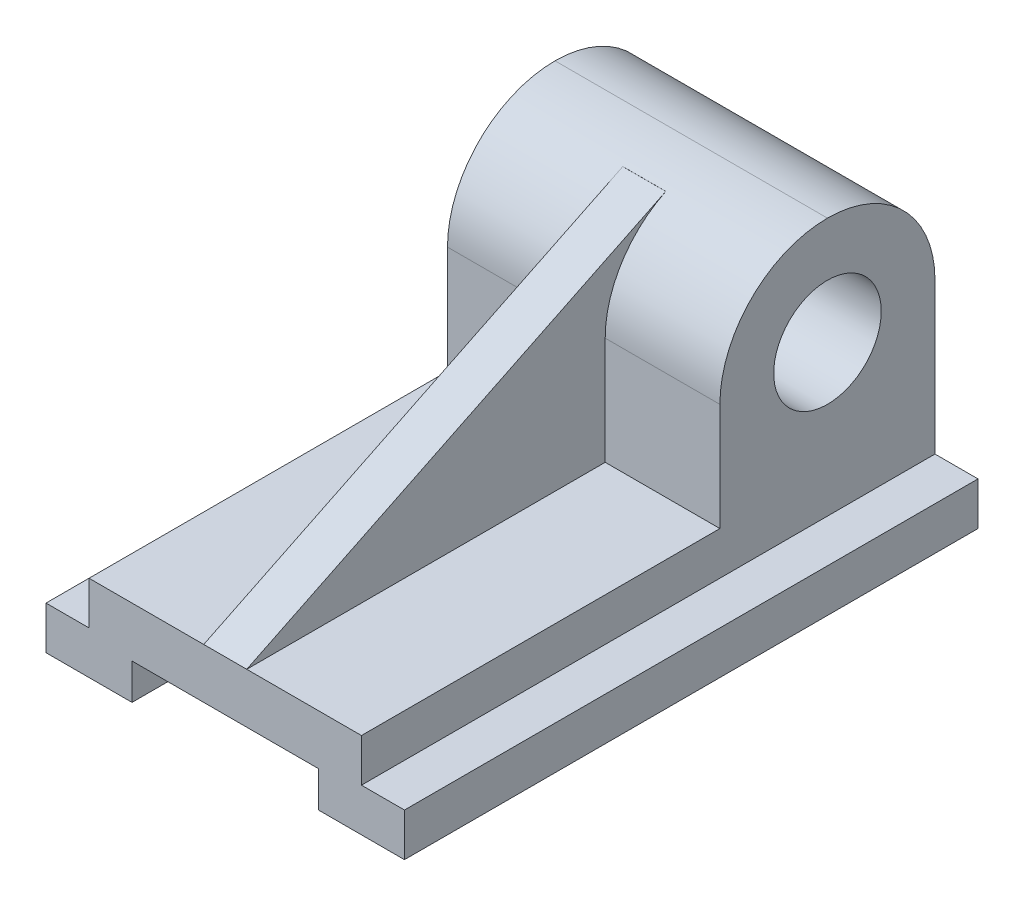
ISO-10303-21;
HEADER;
FILE_DESCRIPTION(('STEP AP214'),'2;1');
FILE_NAME('part.step','',(''),(''),'','','');
FILE_SCHEMA(('AUTOMOTIVE_DESIGN { 1 0 10303 214 1 1 1 1 }'));
ENDSEC;
DATA;
#1=APPLICATION_CONTEXT('core data for automotive mechanical design processes');
#2=APPLICATION_PROTOCOL_DEFINITION('international standard','automotive_design',2000,#1);
#3=PRODUCT_CONTEXT('',#1,'mechanical');
#4=PRODUCT('Part','Part','',(#3));
#5=PRODUCT_RELATED_PRODUCT_CATEGORY('part','',(#4));
#6=PRODUCT_DEFINITION_FORMATION('','',#4);
#7=PRODUCT_DEFINITION_CONTEXT('part definition',#1,'design');
#8=PRODUCT_DEFINITION('design','',#6,#7);
#9=PRODUCT_DEFINITION_SHAPE('','',#8);
#10=(LENGTH_UNIT() NAMED_UNIT(*) SI_UNIT(.MILLI.,.METRE.));
#11=(NAMED_UNIT(*) PLANE_ANGLE_UNIT() SI_UNIT($,.RADIAN.));
#12=(NAMED_UNIT(*) SI_UNIT($,.STERADIAN.) SOLID_ANGLE_UNIT());
#13=UNCERTAINTY_MEASURE_WITH_UNIT(LENGTH_MEASURE(1.E-05),#10,'distance_accuracy_value','');
#14=(GEOMETRIC_REPRESENTATION_CONTEXT(3) GLOBAL_UNCERTAINTY_ASSIGNED_CONTEXT((#13)) GLOBAL_UNIT_ASSIGNED_CONTEXT((#10,
#11,#12)) REPRESENTATION_CONTEXT('',''));
#15=CARTESIAN_POINT('',(0.,0.,0.));
#16=DIRECTION('',(0.,0.,1.));
#17=DIRECTION('',(1.,0.,0.));
#18=AXIS2_PLACEMENT_3D('',#15,#16,#17);
#19=CARTESIAN_POINT('',(-96.52,187.96,152.4));
#20=DIRECTION('',(0.,0.,-1.));
#21=DIRECTION('',(-1.,0.,0.));
#22=AXIS2_PLACEMENT_3D('',#19,#20,#21);
#23=PLANE('',#22);
#24=DIRECTION('',(0.,-1.,0.));
#25=VECTOR('',#24,1.);
#26=CARTESIAN_POINT('',(96.52,187.96,152.4));
#27=LINE('',#26,#25);
#28=CARTESIAN_POINT('',(96.52,111.76,152.4));
#29=VERTEX_POINT('',#28);
#30=CARTESIAN_POINT('',(96.52,35.56,152.4));
#31=VERTEX_POINT('',#30);
#32=EDGE_CURVE('E179',#29,#31,#27,.T.);
#33=ORIENTED_EDGE('',*,*,#32,.F.);
#34=DIRECTION('',(1.,0.,0.));
#35=VECTOR('',#34,1.);
#36=CARTESIAN_POINT('',(-96.52,111.76,152.4));
#37=LINE('',#36,#35);
#38=CARTESIAN_POINT('',(15.24,111.76,152.4));
#39=VERTEX_POINT('',#38);
#40=EDGE_CURVE('E248',#29,#39,#37,.F.);
#41=ORIENTED_EDGE('',*,*,#40,.T.);
#42=DIRECTION('',(0.,-1.,0.));
#43=VECTOR('',#42,1.);
#44=CARTESIAN_POINT('',(15.24,180.34,152.4));
#45=LINE('',#44,#43);
#46=CARTESIAN_POINT('',(15.24,35.56,152.4));
#47=VERTEX_POINT('',#46);
#48=EDGE_CURVE('E197',#39,#47,#45,.T.);
#49=ORIENTED_EDGE('',*,*,#48,.T.);
#50=DIRECTION('',(1.,0.,0.));
#51=VECTOR('',#50,1.);
#52=CARTESIAN_POINT('',(-96.52,35.56,152.4));
#53=LINE('',#52,#51);
#54=EDGE_CURVE('E192',#47,#31,#53,.T.);
#55=ORIENTED_EDGE('',*,*,#54,.T.);
#56=EDGE_LOOP('',(#33,#41,#49,#55));
#57=FACE_BOUND('',#56,.T.);
#58=ADVANCED_FACE('F41',(#57),#23,.F.);
#59=CARTESIAN_POINT('',(96.52,35.56,406.4));
#60=DIRECTION('',(0.,-1.,0.));
#61=DIRECTION('',(1.,0.,0.));
#62=AXIS2_PLACEMENT_3D('',#59,#60,#61);
#63=PLANE('',#62);
#64=DIRECTION('',(0.,0.,-1.));
#65=VECTOR('',#64,1.);
#66=CARTESIAN_POINT('',(15.24,35.56,406.4));
#67=LINE('',#66,#65);
#68=CARTESIAN_POINT('',(15.24,35.56,406.4));
#69=VERTEX_POINT('',#68);
#70=EDGE_CURVE('E290',#69,#47,#67,.T.);
#71=ORIENTED_EDGE('',*,*,#70,.F.);
#72=DIRECTION('',(-1.,0.,0.));
#73=VECTOR('',#72,1.);
#74=CARTESIAN_POINT('',(96.52,35.56,406.4));
#75=LINE('',#74,#73);
#76=CARTESIAN_POINT('',(96.52,35.56,406.4));
#77=VERTEX_POINT('',#76);
#78=EDGE_CURVE('E204',#77,#69,#75,.T.);
#79=ORIENTED_EDGE('',*,*,#78,.F.);
#80=DIRECTION('',(0.,0.,-1.));
#81=VECTOR('',#80,1.);
#82=CARTESIAN_POINT('',(96.52,35.56,406.4));
#83=LINE('',#82,#81);
#84=EDGE_CURVE('E184',#77,#31,#83,.T.);
#85=ORIENTED_EDGE('',*,*,#84,.T.);
#86=ORIENTED_EDGE('',*,*,#54,.F.);
#87=EDGE_LOOP('',(#71,#79,#85,#86));
#88=FACE_BOUND('',#87,.T.);
#89=ADVANCED_FACE('F205',(#88),#63,.F.);
#90=DIRECTION('',(0.,0.,1.));
#91=VECTOR('',#90,1.);
#92=CARTESIAN_POINT('',(-15.24,35.56,406.4));
#93=LINE('',#92,#91);
#94=CARTESIAN_POINT('',(-15.24,35.56,152.4));
#95=VERTEX_POINT('',#94);
#96=CARTESIAN_POINT('',(-15.24,35.56,406.4));
#97=VERTEX_POINT('',#96);
#98=EDGE_CURVE('E279',#95,#97,#93,.T.);
#99=ORIENTED_EDGE('',*,*,#98,.F.);
#100=CARTESIAN_POINT('',(-96.52,35.56,152.4));
#101=VERTEX_POINT('',#100);
#102=EDGE_CURVE('E195',#101,#95,#53,.T.);
#103=ORIENTED_EDGE('',*,*,#102,.F.);
#104=DIRECTION('',(0.,0.,-1.));
#105=VECTOR('',#104,1.);
#106=CARTESIAN_POINT('',(-96.52,35.56,406.4));
#107=LINE('',#106,#105);
#108=CARTESIAN_POINT('',(-96.52,35.56,406.4));
#109=VERTEX_POINT('',#108);
#110=EDGE_CURVE('E206',#109,#101,#107,.T.);
#111=ORIENTED_EDGE('',*,*,#110,.F.);
#112=EDGE_CURVE('E275',#97,#109,#75,.T.);
#113=ORIENTED_EDGE('',*,*,#112,.F.);
#114=EDGE_LOOP('',(#99,#103,#111,#113));
#115=FACE_BOUND('',#114,.T.);
#116=ADVANCED_FACE('F277',(#115),#63,.F.);
#117=DIRECTION('',(0.,-1.,0.));
#118=VECTOR('',#117,1.);
#119=CARTESIAN_POINT('',(-15.24,180.34,152.4));
#120=LINE('',#119,#118);
#121=CARTESIAN_POINT('',(-15.24,111.76,152.4));
#122=VERTEX_POINT('',#121);
#123=EDGE_CURVE('E283',#122,#95,#120,.T.);
#124=ORIENTED_EDGE('',*,*,#123,.F.);
#125=DIRECTION('',(1.,0.,0.));
#126=VECTOR('',#125,1.);
#127=CARTESIAN_POINT('',(-96.52,111.76,152.4));
#128=LINE('',#127,#126);
#129=CARTESIAN_POINT('',(-96.52,111.76,152.4));
#130=VERTEX_POINT('',#129);
#131=EDGE_CURVE('E241',#122,#130,#128,.F.);
#132=ORIENTED_EDGE('',*,*,#131,.T.);
#133=DIRECTION('',(0.,-1.,0.));
#134=VECTOR('',#133,1.);
#135=CARTESIAN_POINT('',(-96.52,187.96,152.4));
#136=LINE('',#135,#134);
#137=EDGE_CURVE('E193',#130,#101,#136,.T.);
#138=ORIENTED_EDGE('',*,*,#137,.T.);
#139=ORIENTED_EDGE('',*,*,#102,.T.);
#140=EDGE_LOOP('',(#124,#132,#138,#139));
#141=FACE_BOUND('',#140,.T.);
#142=ADVANCED_FACE('F365',(#141),#23,.F.);
#143=CARTESIAN_POINT('',(-96.52,35.56,406.4));
#144=DIRECTION('',(1.,0.,0.));
#145=DIRECTION('',(0.,0.,-1.));
#146=AXIS2_PLACEMENT_3D('',#143,#144,#145);
#147=PLANE('',#146);
#148=CARTESIAN_POINT('',(-96.52,111.76,76.2));
#149=DIRECTION('',(1.,0.,0.));
#150=DIRECTION('',(0.,0.,-1.));
#151=AXIS2_PLACEMENT_3D('',#148,#149,#150);
#152=CIRCLE('',#151,38.1);
#153=CARTESIAN_POINT('',(-96.52,111.76,38.1));
#154=VERTEX_POINT('',#153);
#155=EDGE_CURVE('E303',#154,#154,#152,.T.);
#156=ORIENTED_EDGE('',*,*,#155,.T.);
#157=EDGE_LOOP('',(#156));
#158=FACE_BOUND('',#157,.T.);
#159=ORIENTED_EDGE('',*,*,#137,.F.);
#160=CARTESIAN_POINT('',(-96.52,111.76,76.2));
#161=DIRECTION('',(1.,0.,0.));
#162=DIRECTION('',(0.,0.,-1.));
#163=AXIS2_PLACEMENT_3D('',#160,#161,#162);
#164=CIRCLE('',#163,76.2);
#165=CARTESIAN_POINT('',(-96.52,187.96,76.2));
#166=VERTEX_POINT('',#165);
#167=EDGE_CURVE('E247',#130,#166,#164,.F.);
#168=ORIENTED_EDGE('',*,*,#167,.T.);
#169=CARTESIAN_POINT('',(-96.52,111.76,76.2));
#170=DIRECTION('',(1.,0.,0.));
#171=DIRECTION('',(0.,0.,-1.));
#172=AXIS2_PLACEMENT_3D('',#169,#170,#171);
#173=CIRCLE('',#172,76.2);
#174=CARTESIAN_POINT('',(-96.52,111.76,0.));
#175=VERTEX_POINT('',#174);
#176=EDGE_CURVE('E246',#166,#175,#173,.F.);
#177=ORIENTED_EDGE('',*,*,#176,.T.);
#178=DIRECTION('',(0.,-1.,0.));
#179=VECTOR('',#178,1.);
#180=CARTESIAN_POINT('',(-96.52,35.56,0.));
#181=LINE('',#180,#179);
#182=CARTESIAN_POINT('',(-96.52,5.08,0.));
#183=VERTEX_POINT('',#182);
#184=EDGE_CURVE('E308',#175,#183,#181,.T.);
#185=ORIENTED_EDGE('',*,*,#184,.T.);
#186=DIRECTION('',(0.,0.,-1.));
#187=VECTOR('',#186,1.);
#188=CARTESIAN_POINT('',(-96.52,5.08,406.4));
#189=LINE('',#188,#187);
#190=CARTESIAN_POINT('',(-96.52,5.08,406.4));
#191=VERTEX_POINT('',#190);
#192=EDGE_CURVE('E236',#191,#183,#189,.T.);
#193=ORIENTED_EDGE('',*,*,#192,.F.);
#194=DIRECTION('',(0.,-1.,0.));
#195=VECTOR('',#194,1.);
#196=CARTESIAN_POINT('',(-96.52,35.56,406.4));
#197=LINE('',#196,#195);
#198=EDGE_CURVE('E307',#109,#191,#197,.T.);
#199=ORIENTED_EDGE('',*,*,#198,.F.);
#200=ORIENTED_EDGE('',*,*,#110,.T.);
#201=EDGE_LOOP('',(#159,#168,#177,#185,#193,#199,#200));
#202=FACE_BOUND('',#201,.T.);
#203=ADVANCED_FACE('F370',(#158,#202),#147,.F.);
#204=CARTESIAN_POINT('',(-96.52,5.08,406.4));
#205=DIRECTION('',(0.,-1.,0.));
#206=DIRECTION('',(1.,0.,0.));
#207=AXIS2_PLACEMENT_3D('',#204,#205,#206);
#208=PLANE('',#207);
#209=DIRECTION('',(-1.,0.,0.));
#210=VECTOR('',#209,1.);
#211=CARTESIAN_POINT('',(-96.52,5.08,0.));
#212=LINE('',#211,#210);
#213=CARTESIAN_POINT('',(-127.,5.07999999999999,0.));
#214=VERTEX_POINT('',#213);
#215=EDGE_CURVE('E329',#183,#214,#212,.T.);
#216=ORIENTED_EDGE('',*,*,#215,.T.);
#217=DIRECTION('',(0.,0.,-1.));
#218=VECTOR('',#217,1.);
#219=CARTESIAN_POINT('',(-127.,5.07999999999999,406.4));
#220=LINE('',#219,#218);
#221=CARTESIAN_POINT('',(-127.,5.07999999999999,406.4));
#222=VERTEX_POINT('',#221);
#223=EDGE_CURVE('E232',#222,#214,#220,.T.);
#224=ORIENTED_EDGE('',*,*,#223,.F.);
#225=DIRECTION('',(-1.,0.,0.));
#226=VECTOR('',#225,1.);
#227=CARTESIAN_POINT('',(-96.52,5.08,406.4));
#228=LINE('',#227,#226);
#229=EDGE_CURVE('E310',#191,#222,#228,.T.);
#230=ORIENTED_EDGE('',*,*,#229,.F.);
#231=ORIENTED_EDGE('',*,*,#192,.T.);
#232=EDGE_LOOP('',(#216,#224,#230,#231));
#233=FACE_BOUND('',#232,.T.);
#234=ADVANCED_FACE('F373',(#233),#208,.F.);
#235=CARTESIAN_POINT('',(-127.,5.07999999999999,406.4));
#236=DIRECTION('',(1.,0.,0.));
#237=DIRECTION('',(0.,0.,-1.));
#238=AXIS2_PLACEMENT_3D('',#235,#236,#237);
#239=PLANE('',#238);
#240=DIRECTION('',(0.,-1.,0.));
#241=VECTOR('',#240,1.);
#242=CARTESIAN_POINT('',(-127.,5.07999999999999,0.));
#243=LINE('',#242,#241);
#244=CARTESIAN_POINT('',(-127.,-25.4,0.));
#245=VERTEX_POINT('',#244);
#246=EDGE_CURVE('E335',#214,#245,#243,.T.);
#247=ORIENTED_EDGE('',*,*,#246,.T.);
#248=DIRECTION('',(0.,0.,-1.));
#249=VECTOR('',#248,1.);
#250=CARTESIAN_POINT('',(-127.,-25.4,406.4));
#251=LINE('',#250,#249);
#252=CARTESIAN_POINT('',(-127.,-25.4,406.4));
#253=VERTEX_POINT('',#252);
#254=EDGE_CURVE('E235',#253,#245,#251,.T.);
#255=ORIENTED_EDGE('',*,*,#254,.F.);
#256=DIRECTION('',(0.,-1.,0.));
#257=VECTOR('',#256,1.);
#258=CARTESIAN_POINT('',(-127.,5.07999999999999,406.4));
#259=LINE('',#258,#257);
#260=EDGE_CURVE('E315',#222,#253,#259,.T.);
#261=ORIENTED_EDGE('',*,*,#260,.F.);
#262=ORIENTED_EDGE('',*,*,#223,.T.);
#263=EDGE_LOOP('',(#247,#255,#261,#262));
#264=FACE_BOUND('',#263,.T.);
#265=ADVANCED_FACE('F380',(#264),#239,.F.);
#266=CARTESIAN_POINT('',(-127.,-25.4,406.4));
#267=DIRECTION('',(0.,1.,0.));
#268=DIRECTION('',(0.,0.,1.));
#269=AXIS2_PLACEMENT_3D('',#266,#267,#268);
#270=PLANE('',#269);
#271=DIRECTION('',(1.,0.,0.));
#272=VECTOR('',#271,1.);
#273=CARTESIAN_POINT('',(-127.,-25.4,0.));
#274=LINE('',#273,#272);
#275=CARTESIAN_POINT('',(-66.04,-25.4,0.));
#276=VERTEX_POINT('',#275);
#277=EDGE_CURVE('E331',#245,#276,#274,.T.);
#278=ORIENTED_EDGE('',*,*,#277,.T.);
#279=DIRECTION('',(0.,0.,-1.));
#280=VECTOR('',#279,1.);
#281=CARTESIAN_POINT('',(-66.04,-25.4,406.4));
#282=LINE('',#281,#280);
#283=CARTESIAN_POINT('',(-66.04,-25.4,406.4));
#284=VERTEX_POINT('',#283);
#285=EDGE_CURVE('E226',#284,#276,#282,.T.);
#286=ORIENTED_EDGE('',*,*,#285,.F.);
#287=DIRECTION('',(1.,0.,0.));
#288=VECTOR('',#287,1.);
#289=CARTESIAN_POINT('',(-127.,-25.4,406.4));
#290=LINE('',#289,#288);
#291=EDGE_CURVE('E314',#253,#284,#290,.T.);
#292=ORIENTED_EDGE('',*,*,#291,.F.);
#293=ORIENTED_EDGE('',*,*,#254,.T.);
#294=EDGE_LOOP('',(#278,#286,#292,#293));
#295=FACE_BOUND('',#294,.T.);
#296=ADVANCED_FACE('F385',(#295),#270,.F.);
#297=CARTESIAN_POINT('',(-66.04,-25.4,406.4));
#298=DIRECTION('',(-1.,0.,0.));
#299=DIRECTION('',(0.,0.,1.));
#300=AXIS2_PLACEMENT_3D('',#297,#298,#299);
#301=PLANE('',#300);
#302=DIRECTION('',(0.,1.,0.));
#303=VECTOR('',#302,1.);
#304=CARTESIAN_POINT('',(-66.04,-25.4,0.));
#305=LINE('',#304,#303);
#306=CARTESIAN_POINT('',(-66.04,0.,0.));
#307=VERTEX_POINT('',#306);
#308=EDGE_CURVE('E337',#276,#307,#305,.T.);
#309=ORIENTED_EDGE('',*,*,#308,.T.);
#310=DIRECTION('',(0.,0.,-1.));
#311=VECTOR('',#310,1.);
#312=CARTESIAN_POINT('',(-66.04,0.,406.4));
#313=LINE('',#312,#311);
#314=CARTESIAN_POINT('',(-66.04,0.,406.4));
#315=VERTEX_POINT('',#314);
#316=EDGE_CURVE('E227',#315,#307,#313,.T.);
#317=ORIENTED_EDGE('',*,*,#316,.F.);
#318=DIRECTION('',(0.,1.,0.));
#319=VECTOR('',#318,1.);
#320=CARTESIAN_POINT('',(-66.04,-25.4,406.4));
#321=LINE('',#320,#319);
#322=EDGE_CURVE('E316',#284,#315,#321,.T.);
#323=ORIENTED_EDGE('',*,*,#322,.F.);
#324=ORIENTED_EDGE('',*,*,#285,.T.);
#325=EDGE_LOOP('',(#309,#317,#323,#324));
#326=FACE_BOUND('',#325,.T.);
#327=ADVANCED_FACE('F389',(#326),#301,.F.);
#328=CARTESIAN_POINT('',(-66.04,0.,406.4));
#329=DIRECTION('',(0.,1.,0.));
#330=DIRECTION('',(-1.,0.,0.));
#331=AXIS2_PLACEMENT_3D('',#328,#329,#330);
#332=PLANE('',#331);
#333=DIRECTION('',(1.,0.,0.));
#334=VECTOR('',#333,1.);
#335=CARTESIAN_POINT('',(-66.04,0.,0.));
#336=LINE('',#335,#334);
#337=CARTESIAN_POINT('',(66.04,0.,0.));
#338=VERTEX_POINT('',#337);
#339=EDGE_CURVE('E340',#307,#338,#336,.T.);
#340=ORIENTED_EDGE('',*,*,#339,.T.);
#341=DIRECTION('',(0.,0.,-1.));
#342=VECTOR('',#341,1.);
#343=CARTESIAN_POINT('',(66.04,0.,406.4));
#344=LINE('',#343,#342);
#345=CARTESIAN_POINT('',(66.04,0.,406.4));
#346=VERTEX_POINT('',#345);
#347=EDGE_CURVE('E224',#346,#338,#344,.T.);
#348=ORIENTED_EDGE('',*,*,#347,.F.);
#349=DIRECTION('',(1.,0.,0.));
#350=VECTOR('',#349,1.);
#351=CARTESIAN_POINT('',(-66.04,0.,406.4));
#352=LINE('',#351,#350);
#353=EDGE_CURVE('E318',#315,#346,#352,.T.);
#354=ORIENTED_EDGE('',*,*,#353,.F.);
#355=ORIENTED_EDGE('',*,*,#316,.T.);
#356=EDGE_LOOP('',(#340,#348,#354,#355));
#357=FACE_BOUND('',#356,.T.);
#358=ADVANCED_FACE('F394',(#357),#332,.F.);
#359=CARTESIAN_POINT('',(66.04,0.,406.4));
#360=DIRECTION('',(1.,0.,0.));
#361=DIRECTION('',(0.,1.,0.));
#362=AXIS2_PLACEMENT_3D('',#359,#360,#361);
#363=PLANE('',#362);
#364=DIRECTION('',(0.,-1.,0.));
#365=VECTOR('',#364,1.);
#366=CARTESIAN_POINT('',(66.04,0.,0.));
#367=LINE('',#366,#365);
#368=CARTESIAN_POINT('',(66.04,-25.4,0.));
#369=VERTEX_POINT('',#368);
#370=EDGE_CURVE('E338',#338,#369,#367,.T.);
#371=ORIENTED_EDGE('',*,*,#370,.T.);
#372=DIRECTION('',(0.,0.,-1.));
#373=VECTOR('',#372,1.);
#374=CARTESIAN_POINT('',(66.04,-25.4,406.4));
#375=LINE('',#374,#373);
#376=CARTESIAN_POINT('',(66.04,-25.4,406.4));
#377=VERTEX_POINT('',#376);
#378=EDGE_CURVE('E219',#377,#369,#375,.T.);
#379=ORIENTED_EDGE('',*,*,#378,.F.);
#380=DIRECTION('',(0.,-1.,0.));
#381=VECTOR('',#380,1.);
#382=CARTESIAN_POINT('',(66.04,0.,406.4));
#383=LINE('',#382,#381);
#384=EDGE_CURVE('E319',#346,#377,#383,.T.);
#385=ORIENTED_EDGE('',*,*,#384,.F.);
#386=ORIENTED_EDGE('',*,*,#347,.T.);
#387=EDGE_LOOP('',(#371,#379,#385,#386));
#388=FACE_BOUND('',#387,.T.);
#389=ADVANCED_FACE('F400',(#388),#363,.F.);
#390=CARTESIAN_POINT('',(66.04,-25.4,406.4));
#391=DIRECTION('',(0.,1.,0.));
#392=DIRECTION('',(0.,0.,1.));
#393=AXIS2_PLACEMENT_3D('',#390,#391,#392);
#394=PLANE('',#393);
#395=DIRECTION('',(1.,0.,0.));
#396=VECTOR('',#395,1.);
#397=CARTESIAN_POINT('',(66.04,-25.4,0.));
#398=LINE('',#397,#396);
#399=CARTESIAN_POINT('',(127.,-25.4,0.));
#400=VERTEX_POINT('',#399);
#401=EDGE_CURVE('E345',#369,#400,#398,.T.);
#402=ORIENTED_EDGE('',*,*,#401,.T.);
#403=DIRECTION('',(0.,0.,-1.));
#404=VECTOR('',#403,1.);
#405=CARTESIAN_POINT('',(127.,-25.4,406.4));
#406=LINE('',#405,#404);
#407=CARTESIAN_POINT('',(127.,-25.4,406.4));
#408=VERTEX_POINT('',#407);
#409=EDGE_CURVE('E220',#408,#400,#406,.T.);
#410=ORIENTED_EDGE('',*,*,#409,.F.);
#411=DIRECTION('',(1.,0.,0.));
#412=VECTOR('',#411,1.);
#413=CARTESIAN_POINT('',(66.04,-25.4,406.4));
#414=LINE('',#413,#412);
#415=EDGE_CURVE('E325',#377,#408,#414,.T.);
#416=ORIENTED_EDGE('',*,*,#415,.F.);
#417=ORIENTED_EDGE('',*,*,#378,.T.);
#418=EDGE_LOOP('',(#402,#410,#416,#417));
#419=FACE_BOUND('',#418,.T.);
#420=ADVANCED_FACE('F401',(#419),#394,.F.);
#421=CARTESIAN_POINT('',(127.,-25.4,406.4));
#422=DIRECTION('',(-1.,0.,0.));
#423=DIRECTION('',(0.,0.,1.));
#424=AXIS2_PLACEMENT_3D('',#421,#422,#423);
#425=PLANE('',#424);
#426=DIRECTION('',(0.,1.,0.));
#427=VECTOR('',#426,1.);
#428=CARTESIAN_POINT('',(127.,-25.4,0.));
#429=LINE('',#428,#427);
#430=CARTESIAN_POINT('',(127.,5.08000000000001,0.));
#431=VERTEX_POINT('',#430);
#432=EDGE_CURVE('E344',#400,#431,#429,.T.);
#433=ORIENTED_EDGE('',*,*,#432,.T.);
#434=DIRECTION('',(0.,0.,-1.));
#435=VECTOR('',#434,1.);
#436=CARTESIAN_POINT('',(127.,5.08000000000001,406.4));
#437=LINE('',#436,#435);
#438=CARTESIAN_POINT('',(127.,5.08000000000001,406.4));
#439=VERTEX_POINT('',#438);
#440=EDGE_CURVE('E207',#439,#431,#437,.T.);
#441=ORIENTED_EDGE('',*,*,#440,.F.);
#442=DIRECTION('',(0.,1.,0.));
#443=VECTOR('',#442,1.);
#444=CARTESIAN_POINT('',(127.,-25.4,406.4));
#445=LINE('',#444,#443);
#446=EDGE_CURVE('E322',#408,#439,#445,.T.);
#447=ORIENTED_EDGE('',*,*,#446,.F.);
#448=ORIENTED_EDGE('',*,*,#409,.T.);
#449=EDGE_LOOP('',(#433,#441,#447,#448));
#450=FACE_BOUND('',#449,.T.);
#451=ADVANCED_FACE('F409',(#450),#425,.F.);
#452=CARTESIAN_POINT('',(127.,5.08000000000001,406.4));
#453=DIRECTION('',(0.,-1.,0.));
#454=DIRECTION('',(1.,0.,0.));
#455=AXIS2_PLACEMENT_3D('',#452,#453,#454);
#456=PLANE('',#455);
#457=DIRECTION('',(-1.,0.,0.));
#458=VECTOR('',#457,1.);
#459=CARTESIAN_POINT('',(127.,5.08000000000001,0.));
#460=LINE('',#459,#458);
#461=CARTESIAN_POINT('',(96.52,5.07999999999999,0.));
#462=VERTEX_POINT('',#461);
#463=EDGE_CURVE('E347',#431,#462,#460,.T.);
#464=ORIENTED_EDGE('',*,*,#463,.T.);
#465=DIRECTION('',(0.,0.,-1.));
#466=VECTOR('',#465,1.);
#467=CARTESIAN_POINT('',(96.52,5.07999999999999,406.4));
#468=LINE('',#467,#466);
#469=CARTESIAN_POINT('',(96.52,5.07999999999999,406.4));
#470=VERTEX_POINT('',#469);
#471=EDGE_CURVE('E202',#470,#462,#468,.T.);
#472=ORIENTED_EDGE('',*,*,#471,.F.);
#473=DIRECTION('',(-1.,0.,0.));
#474=VECTOR('',#473,1.);
#475=CARTESIAN_POINT('',(127.,5.08000000000001,406.4));
#476=LINE('',#475,#474);
#477=EDGE_CURVE('E326',#439,#470,#476,.T.);
#478=ORIENTED_EDGE('',*,*,#477,.F.);
#479=ORIENTED_EDGE('',*,*,#440,.T.);
#480=EDGE_LOOP('',(#464,#472,#478,#479));
#481=FACE_BOUND('',#480,.T.);
#482=ADVANCED_FACE('F408',(#481),#456,.F.);
#483=CARTESIAN_POINT('',(96.52,5.07999999999999,406.4));
#484=DIRECTION('',(-1.,0.,0.));
#485=DIRECTION('',(0.,0.,1.));
#486=AXIS2_PLACEMENT_3D('',#483,#484,#485);
#487=PLANE('',#486);
#488=CARTESIAN_POINT('',(96.52,111.76,76.2));
#489=DIRECTION('',(1.,0.,0.));
#490=DIRECTION('',(0.,0.,-1.));
#491=AXIS2_PLACEMENT_3D('',#488,#489,#490);
#492=CIRCLE('',#491,38.1);
#493=CARTESIAN_POINT('',(96.52,111.76,38.1));
#494=VERTEX_POINT('',#493);
#495=EDGE_CURVE('E266',#494,#494,#492,.T.);
#496=ORIENTED_EDGE('',*,*,#495,.F.);
#497=EDGE_LOOP('',(#496));
#498=FACE_BOUND('',#497,.T.);
#499=CARTESIAN_POINT('',(96.52,111.76,76.2));
#500=DIRECTION('',(-1.,0.,0.));
#501=DIRECTION('',(0.,0.,1.));
#502=AXIS2_PLACEMENT_3D('',#499,#500,#501);
#503=CIRCLE('',#502,76.2);
#504=CARTESIAN_POINT('',(96.52,111.76,0.));
#505=VERTEX_POINT('',#504);
#506=CARTESIAN_POINT('',(96.52,187.96,76.2));
#507=VERTEX_POINT('',#506);
#508=EDGE_CURVE('E242',#505,#507,#503,.F.);
#509=ORIENTED_EDGE('',*,*,#508,.T.);
#510=CARTESIAN_POINT('',(96.52,111.76,76.2));
#511=DIRECTION('',(-1.,0.,0.));
#512=DIRECTION('',(0.,0.,1.));
#513=AXIS2_PLACEMENT_3D('',#510,#511,#512);
#514=CIRCLE('',#513,76.2);
#515=EDGE_CURVE('E189',#507,#29,#514,.F.);
#516=ORIENTED_EDGE('',*,*,#515,.T.);
#517=ORIENTED_EDGE('',*,*,#32,.T.);
#518=ORIENTED_EDGE('',*,*,#84,.F.);
#519=DIRECTION('',(0.,1.,0.));
#520=VECTOR('',#519,1.);
#521=CARTESIAN_POINT('',(96.52,5.07999999999999,406.4));
#522=LINE('',#521,#520);
#523=EDGE_CURVE('E282',#470,#77,#522,.T.);
#524=ORIENTED_EDGE('',*,*,#523,.F.);
#525=ORIENTED_EDGE('',*,*,#471,.T.);
#526=DIRECTION('',(0.,1.,0.));
#527=VECTOR('',#526,1.);
#528=CARTESIAN_POINT('',(96.52,5.07999999999999,0.));
#529=LINE('',#528,#527);
#530=EDGE_CURVE('E309',#462,#505,#529,.T.);
#531=ORIENTED_EDGE('',*,*,#530,.T.);
#532=EDGE_LOOP('',(#509,#516,#517,#518,#524,#525,#531));
#533=FACE_BOUND('',#532,.T.);
#534=ADVANCED_FACE('F182',(#498,#533),#487,.F.);
#535=CARTESIAN_POINT('',(0.,0.,406.4));
#536=DIRECTION('',(0.,0.,-1.));
#537=DIRECTION('',(-1.,0.,0.));
#538=AXIS2_PLACEMENT_3D('',#535,#536,#537);
#539=PLANE('',#538);
#540=ORIENTED_EDGE('',*,*,#78,.T.);
#541=DIRECTION('',(-1.,0.,0.));
#542=VECTOR('',#541,1.);
#543=CARTESIAN_POINT('',(0.,35.5599999999998,406.4));
#544=LINE('',#543,#542);
#545=EDGE_CURVE('E49',#69,#97,#544,.T.);
#546=ORIENTED_EDGE('',*,*,#545,.T.);
#547=ORIENTED_EDGE('',*,*,#112,.T.);
#548=ORIENTED_EDGE('',*,*,#198,.T.);
#549=ORIENTED_EDGE('',*,*,#229,.T.);
#550=ORIENTED_EDGE('',*,*,#260,.T.);
#551=ORIENTED_EDGE('',*,*,#291,.T.);
#552=ORIENTED_EDGE('',*,*,#322,.T.);
#553=ORIENTED_EDGE('',*,*,#353,.T.);
#554=ORIENTED_EDGE('',*,*,#384,.T.);
#555=ORIENTED_EDGE('',*,*,#415,.T.);
#556=ORIENTED_EDGE('',*,*,#446,.T.);
#557=ORIENTED_EDGE('',*,*,#477,.T.);
#558=ORIENTED_EDGE('',*,*,#523,.T.);
#559=EDGE_LOOP('',(#540,#546,#547,#548,#549,#550,#551,#552,#553,#554,#555,#556,#557,#558));
#560=FACE_BOUND('',#559,.T.);
#561=ADVANCED_FACE('F269',(#560),#539,.F.);
#562=CARTESIAN_POINT('',(0.,0.,0.));
#563=DIRECTION('',(0.,0.,-1.));
#564=DIRECTION('',(-1.,0.,0.));
#565=AXIS2_PLACEMENT_3D('',#562,#563,#564);
#566=PLANE('',#565);
#567=ORIENTED_EDGE('',*,*,#184,.F.);
#568=DIRECTION('',(-1.,0.,0.));
#569=VECTOR('',#568,1.);
#570=CARTESIAN_POINT('',(0.,111.76,0.));
#571=LINE('',#570,#569);
#572=EDGE_CURVE('E252',#175,#505,#571,.F.);
#573=ORIENTED_EDGE('',*,*,#572,.T.);
#574=ORIENTED_EDGE('',*,*,#530,.F.);
#575=ORIENTED_EDGE('',*,*,#463,.F.);
#576=ORIENTED_EDGE('',*,*,#432,.F.);
#577=ORIENTED_EDGE('',*,*,#401,.F.);
#578=ORIENTED_EDGE('',*,*,#370,.F.);
#579=ORIENTED_EDGE('',*,*,#339,.F.);
#580=ORIENTED_EDGE('',*,*,#308,.F.);
#581=ORIENTED_EDGE('',*,*,#277,.F.);
#582=ORIENTED_EDGE('',*,*,#246,.F.);
#583=ORIENTED_EDGE('',*,*,#215,.F.);
#584=EDGE_LOOP('',(#567,#573,#574,#575,#576,#577,#578,#579,#580,#581,#582,#583));
#585=FACE_BOUND('',#584,.T.);
#586=ADVANCED_FACE('F415',(#585),#566,.T.);
#587=CARTESIAN_POINT('',(15.24,180.34,406.4));
#588=DIRECTION('',(-1.,0.,0.));
#589=DIRECTION('',(0.,-1.,0.));
#590=AXIS2_PLACEMENT_3D('',#587,#588,#589);
#591=PLANE('',#590);
#592=DIRECTION('',(0.,0.,-1.));
#593=VECTOR('',#592,1.);
#594=CARTESIAN_POINT('',(15.24,180.34,406.4));
#595=LINE('',#594,#593);
#596=CARTESIAN_POINT('',(15.24,180.34,109.473999999998));
#597=VERTEX_POINT('',#596);
#598=CARTESIAN_POINT('',(15.24,180.34,109.41480994978));
#599=VERTEX_POINT('',#598);
#600=EDGE_CURVE('E288',#597,#599,#595,.T.);
#601=ORIENTED_EDGE('',*,*,#600,.F.);
#602=DIRECTION('',(0.,0.43827213690412,-0.898842329896349));
#603=VECTOR('',#602,1.);
#604=CARTESIAN_POINT('',(15.24,180.34,109.473999999998));
#605=LINE('',#604,#603);
#606=EDGE_CURVE('E65',#597,#69,#605,.F.);
#607=ORIENTED_EDGE('',*,*,#606,.T.);
#608=ORIENTED_EDGE('',*,*,#70,.T.);
#609=ORIENTED_EDGE('',*,*,#48,.F.);
#610=CARTESIAN_POINT('',(15.24,111.76,76.2));
#611=DIRECTION('',(-1.,0.,0.));
#612=DIRECTION('',(0.,-1.,0.));
#613=AXIS2_PLACEMENT_3D('',#610,#611,#612);
#614=CIRCLE('',#613,76.2);
#615=EDGE_CURVE('E255',#39,#599,#614,.T.);
#616=ORIENTED_EDGE('',*,*,#615,.T.);
#617=EDGE_LOOP('',(#601,#607,#608,#609,#616));
#618=FACE_BOUND('',#617,.T.);
#619=ADVANCED_FACE('F294',(#618),#591,.F.);
#620=CARTESIAN_POINT('',(-15.24,180.34,406.4));
#621=DIRECTION('',(1.,0.,0.));
#622=DIRECTION('',(0.,1.,0.));
#623=AXIS2_PLACEMENT_3D('',#620,#621,#622);
#624=PLANE('',#623);
#625=ORIENTED_EDGE('',*,*,#98,.T.);
#626=DIRECTION('',(0.,-0.43827213690412,0.898842329896349));
#627=VECTOR('',#626,1.);
#628=CARTESIAN_POINT('',(-15.24,180.34,109.473999999998));
#629=LINE('',#628,#627);
#630=CARTESIAN_POINT('',(-15.24,180.34,109.473999999998));
#631=VERTEX_POINT('',#630);
#632=EDGE_CURVE('E11',#97,#631,#629,.F.);
#633=ORIENTED_EDGE('',*,*,#632,.T.);
#634=DIRECTION('',(0.,0.,1.));
#635=VECTOR('',#634,1.);
#636=CARTESIAN_POINT('',(-15.24,180.34,406.4));
#637=LINE('',#636,#635);
#638=CARTESIAN_POINT('',(-15.24,180.34,109.41480994978));
#639=VERTEX_POINT('',#638);
#640=EDGE_CURVE('E295',#639,#631,#637,.T.);
#641=ORIENTED_EDGE('',*,*,#640,.F.);
#642=CARTESIAN_POINT('',(-15.24,111.76,76.2));
#643=DIRECTION('',(1.,0.,0.));
#644=DIRECTION('',(0.,1.,0.));
#645=AXIS2_PLACEMENT_3D('',#642,#643,#644);
#646=CIRCLE('',#645,76.2);
#647=EDGE_CURVE('E257',#639,#122,#646,.T.);
#648=ORIENTED_EDGE('',*,*,#647,.T.);
#649=ORIENTED_EDGE('',*,*,#123,.T.);
#650=EDGE_LOOP('',(#625,#633,#641,#648,#649));
#651=FACE_BOUND('',#650,.T.);
#652=ADVANCED_FACE('F285',(#651),#624,.F.);
#653=CARTESIAN_POINT('',(0.,180.34,0.));
#654=DIRECTION('',(0.,-1.,0.));
#655=DIRECTION('',(0.,0.,-1.));
#656=AXIS2_PLACEMENT_3D('',#653,#654,#655);
#657=PLANE('',#656);
#658=ORIENTED_EDGE('',*,*,#640,.T.);
#659=DIRECTION('',(1.,0.,0.));
#660=VECTOR('',#659,1.);
#661=CARTESIAN_POINT('',(0.,180.34,109.473999999998));
#662=LINE('',#661,#660);
#663=EDGE_CURVE('E265',#631,#597,#662,.T.);
#664=ORIENTED_EDGE('',*,*,#663,.T.);
#665=ORIENTED_EDGE('',*,*,#600,.T.);
#666=DIRECTION('',(-1.,0.,0.));
#667=VECTOR('',#666,1.);
#668=CARTESIAN_POINT('',(15.24,180.34,109.41480994978));
#669=LINE('',#668,#667);
#670=EDGE_CURVE('E260',#599,#639,#669,.T.);
#671=ORIENTED_EDGE('',*,*,#670,.T.);
#672=EDGE_LOOP('',(#658,#664,#665,#671));
#673=FACE_BOUND('',#672,.T.);
#674=ADVANCED_FACE('F292',(#673),#657,.F.);
#675=CARTESIAN_POINT('',(-96.52,111.76,76.2));
#676=DIRECTION('',(1.,0.,0.));
#677=DIRECTION('',(0.,0.,-1.));
#678=AXIS2_PLACEMENT_3D('',#675,#676,#677);
#679=CYLINDRICAL_SURFACE('',#678,38.1);
#680=CARTESIAN_POINT('',(-96.52,111.76,38.1));
#681=CARTESIAN_POINT('',(-94.5091666666667,111.76,38.1));
#682=CARTESIAN_POINT('',(-92.4983333333333,111.76,38.1));
#683=CARTESIAN_POINT('',(-88.4766666666667,111.76,38.1));
#684=CARTESIAN_POINT('',(-86.4658333333333,111.76,38.1));
#685=CARTESIAN_POINT('',(-82.4441666666667,111.76,38.1));
#686=CARTESIAN_POINT('',(-80.4333333333333,111.76,38.1));
#687=CARTESIAN_POINT('',(-76.4116666666667,111.76,38.1));
#688=CARTESIAN_POINT('',(-74.4008333333334,111.76,38.1));
#689=CARTESIAN_POINT('',(-70.3791666666667,111.76,38.1));
#690=CARTESIAN_POINT('',(-68.3683333333334,111.76,38.1));
#691=CARTESIAN_POINT('',(-64.3466666666667,111.76,38.1));
#692=CARTESIAN_POINT('',(-62.3358333333333,111.76,38.1));
#693=CARTESIAN_POINT('',(-58.3141666666667,111.76,38.1));
#694=CARTESIAN_POINT('',(-56.3033333333333,111.76,38.1));
#695=CARTESIAN_POINT('',(-52.2816666666667,111.76,38.1));
#696=CARTESIAN_POINT('',(-50.2708333333333,111.76,38.1));
#697=CARTESIAN_POINT('',(-46.2491666666667,111.76,38.1));
#698=CARTESIAN_POINT('',(-44.2383333333333,111.76,38.1));
#699=CARTESIAN_POINT('',(-40.2166666666667,111.76,38.1));
#700=CARTESIAN_POINT('',(-38.2058333333333,111.76,38.1));
#701=CARTESIAN_POINT('',(-34.1841666666667,111.76,38.1));
#702=CARTESIAN_POINT('',(-32.1733333333333,111.76,38.1));
#703=CARTESIAN_POINT('',(-28.1516666666667,111.76,38.1));
#704=CARTESIAN_POINT('',(-26.1408333333333,111.76,38.1));
#705=CARTESIAN_POINT('',(-22.1191666666667,111.76,38.1));
#706=CARTESIAN_POINT('',(-20.1083333333333,111.76,38.1));
#707=CARTESIAN_POINT('',(-16.0866666666667,111.76,38.1));
#708=CARTESIAN_POINT('',(-14.0758333333333,111.76,38.1));
#709=CARTESIAN_POINT('',(-10.0541666666667,111.76,38.1));
#710=CARTESIAN_POINT('',(-8.04333333333334,111.76,38.1));
#711=CARTESIAN_POINT('',(-4.02166666666668,111.76,38.1));
#712=CARTESIAN_POINT('',(-2.01083333333335,111.76,38.1));
#713=CARTESIAN_POINT('',(2.01083333333332,111.76,38.1));
#714=CARTESIAN_POINT('',(4.02166666666665,111.76,38.1));
#715=CARTESIAN_POINT('',(8.04333333333331,111.76,38.1));
#716=CARTESIAN_POINT('',(10.0541666666666,111.76,38.1));
#717=CARTESIAN_POINT('',(14.0758333333333,111.76,38.1));
#718=CARTESIAN_POINT('',(16.0866666666667,111.76,38.1));
#719=CARTESIAN_POINT('',(20.1083333333333,111.76,38.1));
#720=CARTESIAN_POINT('',(22.1191666666667,111.76,38.1));
#721=CARTESIAN_POINT('',(26.1408333333333,111.76,38.1));
#722=CARTESIAN_POINT('',(28.1516666666666,111.76,38.1));
#723=CARTESIAN_POINT('',(32.1733333333333,111.76,38.1));
#724=CARTESIAN_POINT('',(34.1841666666666,111.76,38.1));
#725=CARTESIAN_POINT('',(38.2058333333333,111.76,38.1));
#726=CARTESIAN_POINT('',(40.2166666666666,111.76,38.1));
#727=CARTESIAN_POINT('',(44.2383333333333,111.76,38.1));
#728=CARTESIAN_POINT('',(46.2491666666666,111.76,38.1));
#729=CARTESIAN_POINT('',(50.2708333333333,111.76,38.1));
#730=CARTESIAN_POINT('',(52.2816666666666,111.76,38.1));
#731=CARTESIAN_POINT('',(56.3033333333333,111.76,38.1));
#732=CARTESIAN_POINT('',(58.3141666666666,111.76,38.1));
#733=CARTESIAN_POINT('',(62.3358333333333,111.76,38.1));
#734=CARTESIAN_POINT('',(64.3466666666666,111.76,38.1));
#735=CARTESIAN_POINT('',(68.3683333333333,111.76,38.1));
#736=CARTESIAN_POINT('',(70.3791666666666,111.76,38.1));
#737=CARTESIAN_POINT('',(74.4008333333333,111.76,38.1));
#738=CARTESIAN_POINT('',(76.4116666666666,111.76,38.1));
#739=CARTESIAN_POINT('',(80.4333333333333,111.76,38.1));
#740=CARTESIAN_POINT('',(82.4441666666666,111.76,38.1));
#741=CARTESIAN_POINT('',(86.4658333333333,111.76,38.1));
#742=CARTESIAN_POINT('',(88.4766666666666,111.76,38.1));
#743=CARTESIAN_POINT('',(92.4983333333333,111.76,38.1));
#744=CARTESIAN_POINT('',(94.5091666666666,111.76,38.1));
#745=CARTESIAN_POINT('',(96.52,111.76,38.1));
#746=B_SPLINE_CURVE_WITH_KNOTS('',3,(#680,#681,#682,#683,#684,#685,#686,#687,#688,#689,#690,
#691,#692,#693,#694,#695,#696,#697,#698,#699,#700,#701,#702,#703,#704,#705,#706,#707,#708,#709,
#710,#711,#712,#713,#714,#715,#716,#717,#718,#719,#720,#721,#722,#723,#724,#725,#726,#727,#728,
#729,#730,#731,#732,#733,#734,#735,#736,#737,#738,#739,#740,#741,#742,#743,#744,#745),
.UNSPECIFIED.,.F.,.F.,(4,2,2,2,2,2,2,2,2,2,2,2,2,2,2,2,2,2,2,2,2,2,2,2,2,2,2,2,2,2,2,2,4),(0.,
6.0325,12.065,18.0975,24.13,30.1625,36.195,42.2275,48.26,54.2925,60.325,66.3575,72.39,78.4225,
84.455,90.4875,96.52,102.5525,108.585,114.6175,120.65,126.6825,132.715,138.7475,144.78,150.8125,
156.845,162.8775,168.91,174.9425,180.975,187.0075,193.04),.UNSPECIFIED.);
#747=EDGE_CURVE('BSEAM462',#154,#494,#746,.T.);
#748=ORIENTED_EDGE('',*,*,#155,.F.);
#749=ORIENTED_EDGE('',*,*,#495,.T.);
#750=ORIENTED_EDGE('',*,*,#747,.T.);
#751=ORIENTED_EDGE('',*,*,#747,.F.);
#752=EDGE_LOOP('',(#748,#750,#749,#751));
#753=FACE_BOUND('',#752,.T.);
#754=ADVANCED_FACE('F462',(#753),#679,.F.);
#755=CARTESIAN_POINT('',(0.,111.76,76.2));
#756=DIRECTION('',(-1.,0.,0.));
#757=DIRECTION('',(0.,-1.,0.));
#758=AXIS2_PLACEMENT_3D('',#755,#756,#757);
#759=CYLINDRICAL_SURFACE('',#758,76.2);
#760=ORIENTED_EDGE('',*,*,#572,.F.);
#761=ORIENTED_EDGE('',*,*,#176,.F.);
#762=DIRECTION('',(-1.,0.,0.));
#763=VECTOR('',#762,1.);
#764=CARTESIAN_POINT('',(0.,187.96,76.2));
#765=LINE('',#764,#763);
#766=EDGE_CURVE('E263',#507,#166,#765,.T.);
#767=ORIENTED_EDGE('',*,*,#766,.F.);
#768=ORIENTED_EDGE('',*,*,#508,.F.);
#769=EDGE_LOOP('',(#760,#761,#767,#768));
#770=FACE_BOUND('',#769,.T.);
#771=ADVANCED_FACE('F358',(#770),#759,.T.);
#772=CARTESIAN_POINT('',(0.,111.76,76.2));
#773=DIRECTION('',(-1.,0.,0.));
#774=DIRECTION('',(0.,0.,1.));
#775=AXIS2_PLACEMENT_3D('',#772,#773,#774);
#776=CYLINDRICAL_SURFACE('',#775,76.2);
#777=ORIENTED_EDGE('',*,*,#615,.F.);
#778=ORIENTED_EDGE('',*,*,#40,.F.);
#779=ORIENTED_EDGE('',*,*,#515,.F.);
#780=ORIENTED_EDGE('',*,*,#766,.T.);
#781=ORIENTED_EDGE('',*,*,#167,.F.);
#782=ORIENTED_EDGE('',*,*,#131,.F.);
#783=ORIENTED_EDGE('',*,*,#647,.F.);
#784=ORIENTED_EDGE('',*,*,#670,.F.);
#785=EDGE_LOOP('',(#777,#778,#779,#780,#781,#782,#783,#784));
#786=FACE_BOUND('',#785,.T.);
#787=ADVANCED_FACE('F357',(#786),#776,.T.);
#788=CARTESIAN_POINT('',(0.,180.34,109.473999999998));
#789=DIRECTION('',(0.,-0.898842329896349,-0.43827213690412));
#790=DIRECTION('',(1.,0.,0.));
#791=AXIS2_PLACEMENT_3D('',#788,#789,#790);
#792=PLANE('',#791);
#793=ORIENTED_EDGE('',*,*,#632,.F.);
#794=ORIENTED_EDGE('',*,*,#545,.F.);
#795=ORIENTED_EDGE('',*,*,#606,.F.);
#796=ORIENTED_EDGE('',*,*,#663,.F.);
#797=EDGE_LOOP('',(#793,#794,#795,#796));
#798=FACE_BOUND('',#797,.T.);
#799=ADVANCED_FACE('F42',(#798),#792,.F.);
#800=CLOSED_SHELL('',(#58,#89,#116,#142,#203,#234,#265,#296,#327,#358,#389,#420,#451,#482,#534,
#561,#586,#619,#652,#674,#754,#771,#787,#799));
#801=MANIFOLD_SOLID_BREP('B2',#800);
#802=ADVANCED_BREP_SHAPE_REPRESENTATION('',(#18,#801),#14);
#803=SHAPE_DEFINITION_REPRESENTATION(#9,#802);
ENDSEC;
END-ISO-10303-21;
